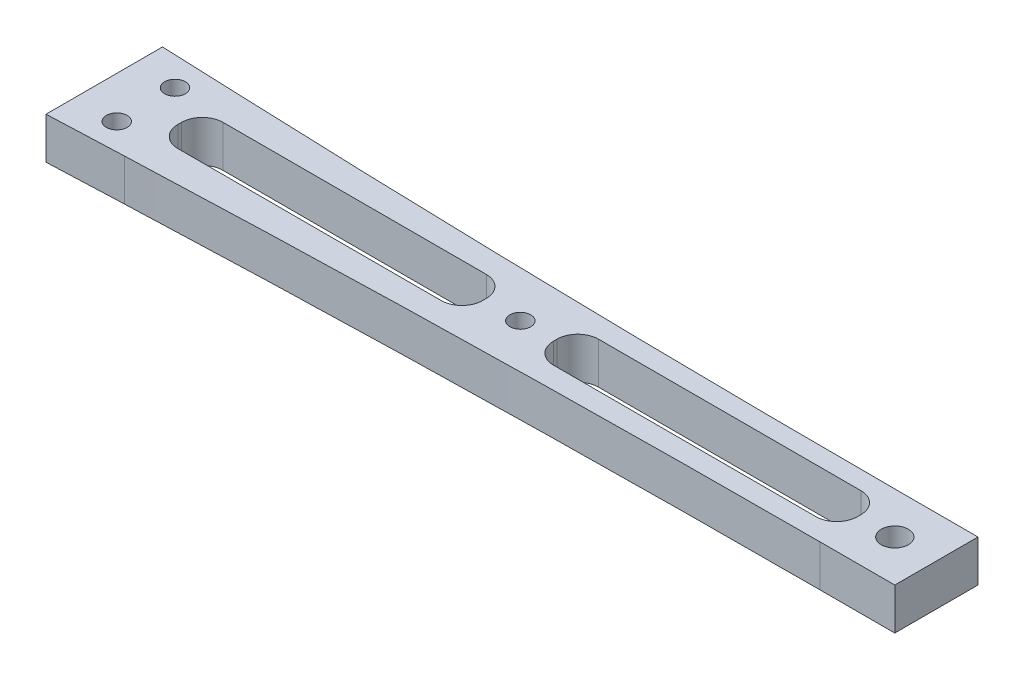
ISO-10303-21;
HEADER;
FILE_DESCRIPTION(('STEP AP214'),'2;1');
FILE_NAME('part.step','',(''),(''),'','','');
FILE_SCHEMA(('AUTOMOTIVE_DESIGN { 1 0 10303 214 1 1 1 1 }'));
ENDSEC;
DATA;
#1=APPLICATION_CONTEXT('core data for automotive mechanical design processes');
#2=APPLICATION_PROTOCOL_DEFINITION('international standard','automotive_design',2000,#1);
#3=PRODUCT_CONTEXT('',#1,'mechanical');
#4=PRODUCT('Part','Part','',(#3));
#5=PRODUCT_RELATED_PRODUCT_CATEGORY('part','',(#4));
#6=PRODUCT_DEFINITION_FORMATION('','',#4);
#7=PRODUCT_DEFINITION_CONTEXT('part definition',#1,'design');
#8=PRODUCT_DEFINITION('design','',#6,#7);
#9=PRODUCT_DEFINITION_SHAPE('','',#8);
#10=(LENGTH_UNIT() NAMED_UNIT(*) SI_UNIT(.MILLI.,.METRE.));
#11=(NAMED_UNIT(*) PLANE_ANGLE_UNIT() SI_UNIT($,.RADIAN.));
#12=(NAMED_UNIT(*) SI_UNIT($,.STERADIAN.) SOLID_ANGLE_UNIT());
#13=UNCERTAINTY_MEASURE_WITH_UNIT(LENGTH_MEASURE(1.E-05),#10,'distance_accuracy_value','');
#14=(GEOMETRIC_REPRESENTATION_CONTEXT(3) GLOBAL_UNCERTAINTY_ASSIGNED_CONTEXT((#13)) GLOBAL_UNIT_ASSIGNED_CONTEXT((#10,
#11,#12)) REPRESENTATION_CONTEXT('',''));
#15=CARTESIAN_POINT('',(0.,0.,0.));
#16=DIRECTION('',(0.,0.,1.));
#17=DIRECTION('',(1.,0.,0.));
#18=AXIS2_PLACEMENT_3D('',#15,#16,#17);
#19=CARTESIAN_POINT('',(113.225148065724,10.,-10.5745762799879));
#20=DIRECTION('',(0.,-1.,0.));
#21=DIRECTION('',(0.,0.,-1.));
#22=AXIS2_PLACEMENT_3D('',#19,#20,#21);
#23=CYLINDRICAL_SURFACE('',#22,5.00000000000001);
#24=CARTESIAN_POINT('',(113.225148065724,0.,-10.5745762799879));
#25=DIRECTION('',(0.,1.,0.));
#26=DIRECTION('',(0.,0.,1.));
#27=AXIS2_PLACEMENT_3D('',#24,#25,#26);
#28=CIRCLE('',#27,5.00000000000001);
#29=CARTESIAN_POINT('',(113.225148065724,0.,-15.5745762799879));
#30=VERTEX_POINT('',#29);
#31=CARTESIAN_POINT('',(108.225148065724,0.,-10.5745762799879));
#32=VERTEX_POINT('',#31);
#33=EDGE_CURVE('E385',#30,#32,#28,.T.);
#34=ORIENTED_EDGE('',*,*,#33,.F.);
#35=DIRECTION('',(0.,-1.,0.));
#36=VECTOR('',#35,1.);
#37=CARTESIAN_POINT('',(113.225148065724,10.,-15.5745762799879));
#38=LINE('',#37,#36);
#39=CARTESIAN_POINT('',(113.225148065724,10.,-15.5745762799879));
#40=VERTEX_POINT('',#39);
#41=EDGE_CURVE('E254',#40,#30,#38,.T.);
#42=ORIENTED_EDGE('',*,*,#41,.F.);
#43=CARTESIAN_POINT('',(113.225148065724,10.,-10.5745762799879));
#44=DIRECTION('',(0.,1.,0.));
#45=DIRECTION('',(0.,0.,1.));
#46=AXIS2_PLACEMENT_3D('',#43,#44,#45);
#47=CIRCLE('',#46,5.00000000000001);
#48=CARTESIAN_POINT('',(108.225148065724,10.,-10.5745762799879));
#49=VERTEX_POINT('',#48);
#50=EDGE_CURVE('E474',#40,#49,#47,.T.);
#51=ORIENTED_EDGE('',*,*,#50,.T.);
#52=DIRECTION('',(0.,-1.,0.));
#53=VECTOR('',#52,1.);
#54=CARTESIAN_POINT('',(108.225148065724,10.,-10.5745762799879));
#55=LINE('',#54,#53);
#56=EDGE_CURVE('E289',#49,#32,#55,.T.);
#57=ORIENTED_EDGE('',*,*,#56,.T.);
#58=EDGE_LOOP('',(#34,#42,#51,#57));
#59=FACE_BOUND('',#58,.T.);
#60=ADVANCED_FACE('F48',(#59),#23,.F.);
#61=CARTESIAN_POINT('',(0.,10.,-15.5745762799879));
#62=DIRECTION('',(0.,0.,-1.));
#63=DIRECTION('',(-1.,0.,0.));
#64=AXIS2_PLACEMENT_3D('',#61,#62,#63);
#65=PLANE('',#64);
#66=DIRECTION('',(1.,0.,0.));
#67=VECTOR('',#66,1.);
#68=CARTESIAN_POINT('',(0.,0.,-15.5745762799879));
#69=LINE('',#68,#67);
#70=CARTESIAN_POINT('',(176.28620966279,0.,-15.5745762799879));
#71=VERTEX_POINT('',#70);
#72=EDGE_CURVE('E389',#30,#71,#69,.T.);
#73=ORIENTED_EDGE('',*,*,#72,.T.);
#74=DIRECTION('',(0.,-1.,0.));
#75=VECTOR('',#74,1.);
#76=CARTESIAN_POINT('',(176.28620966279,10.,-15.5745762799879));
#77=LINE('',#76,#75);
#78=CARTESIAN_POINT('',(176.28620966279,10.,-15.5745762799879));
#79=VERTEX_POINT('',#78);
#80=EDGE_CURVE('E271',#79,#71,#77,.T.);
#81=ORIENTED_EDGE('',*,*,#80,.F.);
#82=DIRECTION('',(1.,0.,0.));
#83=VECTOR('',#82,1.);
#84=CARTESIAN_POINT('',(0.,10.,-15.5745762799879));
#85=LINE('',#84,#83);
#86=EDGE_CURVE('E478',#40,#79,#85,.T.);
#87=ORIENTED_EDGE('',*,*,#86,.F.);
#88=ORIENTED_EDGE('',*,*,#41,.T.);
#89=EDGE_LOOP('',(#73,#81,#87,#88));
#90=FACE_BOUND('',#89,.T.);
#91=ADVANCED_FACE('F530',(#90),#65,.F.);
#92=CARTESIAN_POINT('',(176.28620966279,10.,-10.5745762799879));
#93=DIRECTION('',(0.,-1.,0.));
#94=DIRECTION('',(0.,0.,-1.));
#95=AXIS2_PLACEMENT_3D('',#92,#93,#94);
#96=CYLINDRICAL_SURFACE('',#95,4.99999999999999);
#97=CARTESIAN_POINT('',(176.28620966279,0.,-10.5745762799879));
#98=DIRECTION('',(0.,1.,0.));
#99=DIRECTION('',(0.,0.,1.));
#100=AXIS2_PLACEMENT_3D('',#97,#98,#99);
#101=CIRCLE('',#100,4.99999999999999);
#102=CARTESIAN_POINT('',(181.28620966279,0.,-10.5745762799879));
#103=VERTEX_POINT('',#102);
#104=EDGE_CURVE('E393',#103,#71,#101,.T.);
#105=ORIENTED_EDGE('',*,*,#104,.F.);
#106=DIRECTION('',(0.,-1.,0.));
#107=VECTOR('',#106,1.);
#108=CARTESIAN_POINT('',(181.28620966279,10.,-10.5745762799879));
#109=LINE('',#108,#107);
#110=CARTESIAN_POINT('',(181.28620966279,10.,-10.5745762799879));
#111=VERTEX_POINT('',#110);
#112=EDGE_CURVE('E274',#111,#103,#109,.T.);
#113=ORIENTED_EDGE('',*,*,#112,.F.);
#114=CARTESIAN_POINT('',(176.28620966279,10.,-10.5745762799879));
#115=DIRECTION('',(0.,1.,0.));
#116=DIRECTION('',(0.,0.,1.));
#117=AXIS2_PLACEMENT_3D('',#114,#115,#116);
#118=CIRCLE('',#117,4.99999999999999);
#119=EDGE_CURVE('E481',#111,#79,#118,.T.);
#120=ORIENTED_EDGE('',*,*,#119,.T.);
#121=ORIENTED_EDGE('',*,*,#80,.T.);
#122=EDGE_LOOP('',(#105,#113,#120,#121));
#123=FACE_BOUND('',#122,.T.);
#124=ADVANCED_FACE('F536',(#123),#96,.F.);
#125=CARTESIAN_POINT('',(181.28620966279,10.,0.));
#126=DIRECTION('',(1.,0.,0.));
#127=DIRECTION('',(0.,0.,-1.));
#128=AXIS2_PLACEMENT_3D('',#125,#126,#127);
#129=PLANE('',#128);
#130=DIRECTION('',(0.,0.,1.));
#131=VECTOR('',#130,1.);
#132=CARTESIAN_POINT('',(181.28620966279,0.,0.));
#133=LINE('',#132,#131);
#134=CARTESIAN_POINT('',(181.28620966279,0.,-9.75277634577933));
#135=VERTEX_POINT('',#134);
#136=EDGE_CURVE('E397',#103,#135,#133,.T.);
#137=ORIENTED_EDGE('',*,*,#136,.T.);
#138=DIRECTION('',(0.,-1.,0.));
#139=VECTOR('',#138,1.);
#140=CARTESIAN_POINT('',(181.28620966279,10.,-9.75277634577933));
#141=LINE('',#140,#139);
#142=CARTESIAN_POINT('',(181.28620966279,10.,-9.75277634577933));
#143=VERTEX_POINT('',#142);
#144=EDGE_CURVE('E277',#143,#135,#141,.T.);
#145=ORIENTED_EDGE('',*,*,#144,.F.);
#146=DIRECTION('',(0.,0.,1.));
#147=VECTOR('',#146,1.);
#148=CARTESIAN_POINT('',(181.28620966279,10.,0.));
#149=LINE('',#148,#147);
#150=EDGE_CURVE('E485',#111,#143,#149,.T.);
#151=ORIENTED_EDGE('',*,*,#150,.F.);
#152=ORIENTED_EDGE('',*,*,#112,.T.);
#153=EDGE_LOOP('',(#137,#145,#151,#152));
#154=FACE_BOUND('',#153,.T.);
#155=ADVANCED_FACE('F633',(#154),#129,.F.);
#156=CARTESIAN_POINT('',(176.28620966279,10.,-9.75277634577931));
#157=DIRECTION('',(0.,-1.,0.));
#158=DIRECTION('',(0.,0.,-1.));
#159=AXIS2_PLACEMENT_3D('',#156,#157,#158);
#160=CYLINDRICAL_SURFACE('',#159,4.99999999999999);
#161=CARTESIAN_POINT('',(176.28620966279,0.,-9.75277634577931));
#162=DIRECTION('',(0.,1.,0.));
#163=DIRECTION('',(0.,0.,1.));
#164=AXIS2_PLACEMENT_3D('',#161,#162,#163);
#165=CIRCLE('',#164,4.99999999999999);
#166=CARTESIAN_POINT('',(176.28620966279,0.,-4.75277634577932));
#167=VERTEX_POINT('',#166);
#168=EDGE_CURVE('E401',#167,#135,#165,.T.);
#169=ORIENTED_EDGE('',*,*,#168,.F.);
#170=DIRECTION('',(0.,-1.,0.));
#171=VECTOR('',#170,1.);
#172=CARTESIAN_POINT('',(176.28620966279,10.,-4.75277634577932));
#173=LINE('',#172,#171);
#174=CARTESIAN_POINT('',(176.28620966279,10.,-4.75277634577932));
#175=VERTEX_POINT('',#174);
#176=EDGE_CURVE('E280',#175,#167,#173,.T.);
#177=ORIENTED_EDGE('',*,*,#176,.F.);
#178=CARTESIAN_POINT('',(176.28620966279,10.,-9.75277634577931));
#179=DIRECTION('',(0.,1.,0.));
#180=DIRECTION('',(0.,0.,1.));
#181=AXIS2_PLACEMENT_3D('',#178,#179,#180);
#182=CIRCLE('',#181,4.99999999999999);
#183=EDGE_CURVE('E488',#175,#143,#182,.T.);
#184=ORIENTED_EDGE('',*,*,#183,.T.);
#185=ORIENTED_EDGE('',*,*,#144,.T.);
#186=EDGE_LOOP('',(#169,#177,#184,#185));
#187=FACE_BOUND('',#186,.T.);
#188=ADVANCED_FACE('F629',(#187),#160,.F.);
#189=CARTESIAN_POINT('',(0.,10.,-4.75277634577934));
#190=DIRECTION('',(0.,0.,-1.));
#191=DIRECTION('',(-1.,0.,0.));
#192=AXIS2_PLACEMENT_3D('',#189,#190,#191);
#193=PLANE('',#192);
#194=DIRECTION('',(1.,0.,0.));
#195=VECTOR('',#194,1.);
#196=CARTESIAN_POINT('',(0.,0.,-4.75277634577934));
#197=LINE('',#196,#195);
#198=CARTESIAN_POINT('',(113.225148065724,0.,-4.75277634577933));
#199=VERTEX_POINT('',#198);
#200=EDGE_CURVE('E405',#199,#167,#197,.T.);
#201=ORIENTED_EDGE('',*,*,#200,.F.);
#202=DIRECTION('',(0.,-1.,0.));
#203=VECTOR('',#202,1.);
#204=CARTESIAN_POINT('',(113.225148065724,10.,-4.75277634577933));
#205=LINE('',#204,#203);
#206=CARTESIAN_POINT('',(113.225148065724,10.,-4.75277634577933));
#207=VERTEX_POINT('',#206);
#208=EDGE_CURVE('E283',#207,#199,#205,.T.);
#209=ORIENTED_EDGE('',*,*,#208,.F.);
#210=DIRECTION('',(1.,0.,0.));
#211=VECTOR('',#210,1.);
#212=CARTESIAN_POINT('',(0.,10.,-4.75277634577934));
#213=LINE('',#212,#211);
#214=EDGE_CURVE('E492',#207,#175,#213,.T.);
#215=ORIENTED_EDGE('',*,*,#214,.T.);
#216=ORIENTED_EDGE('',*,*,#176,.T.);
#217=EDGE_LOOP('',(#201,#209,#215,#216));
#218=FACE_BOUND('',#217,.T.);
#219=ADVANCED_FACE('F625',(#218),#193,.T.);
#220=CARTESIAN_POINT('',(113.225148065724,10.,-9.75277634577931));
#221=DIRECTION('',(0.,-1.,0.));
#222=DIRECTION('',(0.,0.,-1.));
#223=AXIS2_PLACEMENT_3D('',#220,#221,#222);
#224=CYLINDRICAL_SURFACE('',#223,5.);
#225=CARTESIAN_POINT('',(113.225148065724,0.,-9.75277634577931));
#226=DIRECTION('',(0.,1.,0.));
#227=DIRECTION('',(0.,0.,1.));
#228=AXIS2_PLACEMENT_3D('',#225,#226,#227);
#229=CIRCLE('',#228,5.);
#230=CARTESIAN_POINT('',(108.225148065724,0.,-9.75277634577933));
#231=VERTEX_POINT('',#230);
#232=EDGE_CURVE('E409',#199,#231,#229,.F.);
#233=ORIENTED_EDGE('',*,*,#232,.T.);
#234=DIRECTION('',(0.,-1.,0.));
#235=VECTOR('',#234,1.);
#236=CARTESIAN_POINT('',(108.225148065724,10.,-9.75277634577933));
#237=LINE('',#236,#235);
#238=CARTESIAN_POINT('',(108.225148065724,10.,-9.75277634577933));
#239=VERTEX_POINT('',#238);
#240=EDGE_CURVE('E286',#239,#231,#237,.T.);
#241=ORIENTED_EDGE('',*,*,#240,.F.);
#242=CARTESIAN_POINT('',(113.225148065724,10.,-9.75277634577931));
#243=DIRECTION('',(0.,1.,0.));
#244=DIRECTION('',(0.,0.,1.));
#245=AXIS2_PLACEMENT_3D('',#242,#243,#244);
#246=CIRCLE('',#245,5.);
#247=EDGE_CURVE('E496',#207,#239,#246,.F.);
#248=ORIENTED_EDGE('',*,*,#247,.F.);
#249=ORIENTED_EDGE('',*,*,#208,.T.);
#250=EDGE_LOOP('',(#233,#241,#248,#249));
#251=FACE_BOUND('',#250,.T.);
#252=ADVANCED_FACE('F573',(#251),#224,.F.);
#253=CARTESIAN_POINT('',(22.9848223233018,10.,-10.5745762799879));
#254=DIRECTION('',(0.,-1.,0.));
#255=DIRECTION('',(0.,0.,-1.));
#256=AXIS2_PLACEMENT_3D('',#253,#254,#255);
#257=CYLINDRICAL_SURFACE('',#256,5.00000000000001);
#258=CARTESIAN_POINT('',(22.9848223233018,0.,-10.5745762799879));
#259=DIRECTION('',(0.,1.,0.));
#260=DIRECTION('',(0.,0.,1.));
#261=AXIS2_PLACEMENT_3D('',#258,#259,#260);
#262=CIRCLE('',#261,5.00000000000001);
#263=CARTESIAN_POINT('',(22.9848223233018,0.,-15.5745762799879));
#264=VERTEX_POINT('',#263);
#265=CARTESIAN_POINT('',(17.9848223233018,0.,-10.5745762799879));
#266=VERTEX_POINT('',#265);
#267=EDGE_CURVE('E353',#264,#266,#262,.T.);
#268=ORIENTED_EDGE('',*,*,#267,.F.);
#269=DIRECTION('',(0.,-1.,0.));
#270=VECTOR('',#269,1.);
#271=CARTESIAN_POINT('',(22.9848223233018,10.,-15.5745762799879));
#272=LINE('',#271,#270);
#273=CARTESIAN_POINT('',(22.9848223233018,10.,-15.5745762799879));
#274=VERTEX_POINT('',#273);
#275=EDGE_CURVE('E292',#274,#264,#272,.T.);
#276=ORIENTED_EDGE('',*,*,#275,.F.);
#277=CARTESIAN_POINT('',(22.9848223233018,10.,-10.5745762799879));
#278=DIRECTION('',(0.,1.,0.));
#279=DIRECTION('',(0.,0.,1.));
#280=AXIS2_PLACEMENT_3D('',#277,#278,#279);
#281=CIRCLE('',#280,5.00000000000001);
#282=CARTESIAN_POINT('',(17.9848223233018,10.,-10.5745762799879));
#283=VERTEX_POINT('',#282);
#284=EDGE_CURVE('E445',#274,#283,#281,.T.);
#285=ORIENTED_EDGE('',*,*,#284,.T.);
#286=DIRECTION('',(0.,-1.,0.));
#287=VECTOR('',#286,1.);
#288=CARTESIAN_POINT('',(17.9848223233018,10.,-10.5745762799879));
#289=LINE('',#288,#287);
#290=EDGE_CURVE('E240',#283,#266,#289,.T.);
#291=ORIENTED_EDGE('',*,*,#290,.T.);
#292=EDGE_LOOP('',(#268,#276,#285,#291));
#293=FACE_BOUND('',#292,.T.);
#294=ADVANCED_FACE('F569',(#293),#257,.F.);
#295=CARTESIAN_POINT('',(0.,10.,-15.5745762799879));
#296=DIRECTION('',(0.,0.,-1.));
#297=DIRECTION('',(-1.,0.,0.));
#298=AXIS2_PLACEMENT_3D('',#295,#296,#297);
#299=PLANE('',#298);
#300=DIRECTION('',(1.,0.,0.));
#301=VECTOR('',#300,1.);
#302=CARTESIAN_POINT('',(0.,0.,-15.5745762799879));
#303=LINE('',#302,#301);
#304=CARTESIAN_POINT('',(86.2593923796302,0.,-15.5745762799879));
#305=VERTEX_POINT('',#304);
#306=EDGE_CURVE('E357',#264,#305,#303,.T.);
#307=ORIENTED_EDGE('',*,*,#306,.T.);
#308=DIRECTION('',(0.,-1.,0.));
#309=VECTOR('',#308,1.);
#310=CARTESIAN_POINT('',(86.2593923796302,10.,-15.5745762799879));
#311=LINE('',#310,#309);
#312=CARTESIAN_POINT('',(86.2593923796302,10.,-15.5745762799879));
#313=VERTEX_POINT('',#312);
#314=EDGE_CURVE('E295',#313,#305,#311,.T.);
#315=ORIENTED_EDGE('',*,*,#314,.F.);
#316=DIRECTION('',(1.,0.,0.));
#317=VECTOR('',#316,1.);
#318=CARTESIAN_POINT('',(0.,10.,-15.5745762799879));
#319=LINE('',#318,#317);
#320=EDGE_CURVE('E449',#274,#313,#319,.T.);
#321=ORIENTED_EDGE('',*,*,#320,.F.);
#322=ORIENTED_EDGE('',*,*,#275,.T.);
#323=EDGE_LOOP('',(#307,#315,#321,#322));
#324=FACE_BOUND('',#323,.T.);
#325=ADVANCED_FACE('F565',(#324),#299,.F.);
#326=CARTESIAN_POINT('',(86.2593923796302,10.,-10.5745762799879));
#327=DIRECTION('',(0.,-1.,0.));
#328=DIRECTION('',(0.,0.,-1.));
#329=AXIS2_PLACEMENT_3D('',#326,#327,#328);
#330=CYLINDRICAL_SURFACE('',#329,4.99999999999999);
#331=CARTESIAN_POINT('',(86.2593923796302,0.,-10.5745762799879));
#332=DIRECTION('',(0.,1.,0.));
#333=DIRECTION('',(0.,0.,1.));
#334=AXIS2_PLACEMENT_3D('',#331,#332,#333);
#335=CIRCLE('',#334,4.99999999999999);
#336=CARTESIAN_POINT('',(91.2593923796302,0.,-10.5745762799879));
#337=VERTEX_POINT('',#336);
#338=EDGE_CURVE('E361',#337,#305,#335,.T.);
#339=ORIENTED_EDGE('',*,*,#338,.F.);
#340=DIRECTION('',(0.,-1.,0.));
#341=VECTOR('',#340,1.);
#342=CARTESIAN_POINT('',(91.2593923796302,10.,-10.5745762799879));
#343=LINE('',#342,#341);
#344=CARTESIAN_POINT('',(91.2593923796302,10.,-10.5745762799879));
#345=VERTEX_POINT('',#344);
#346=EDGE_CURVE('E298',#345,#337,#343,.T.);
#347=ORIENTED_EDGE('',*,*,#346,.F.);
#348=CARTESIAN_POINT('',(86.2593923796302,10.,-10.5745762799879));
#349=DIRECTION('',(0.,1.,0.));
#350=DIRECTION('',(0.,0.,1.));
#351=AXIS2_PLACEMENT_3D('',#348,#349,#350);
#352=CIRCLE('',#351,4.99999999999999);
#353=EDGE_CURVE('E452',#345,#313,#352,.T.);
#354=ORIENTED_EDGE('',*,*,#353,.T.);
#355=ORIENTED_EDGE('',*,*,#314,.T.);
#356=EDGE_LOOP('',(#339,#347,#354,#355));
#357=FACE_BOUND('',#356,.T.);
#358=ADVANCED_FACE('F561',(#357),#330,.F.);
#359=CARTESIAN_POINT('',(91.2593923796302,10.,0.));
#360=DIRECTION('',(1.,0.,0.));
#361=DIRECTION('',(0.,0.,-1.));
#362=AXIS2_PLACEMENT_3D('',#359,#360,#361);
#363=PLANE('',#362);
#364=DIRECTION('',(0.,0.,1.));
#365=VECTOR('',#364,1.);
#366=CARTESIAN_POINT('',(91.2593923796302,0.,0.));
#367=LINE('',#366,#365);
#368=CARTESIAN_POINT('',(91.2593923796302,0.,-9.69671937911455));
#369=VERTEX_POINT('',#368);
#370=EDGE_CURVE('E365',#337,#369,#367,.T.);
#371=ORIENTED_EDGE('',*,*,#370,.T.);
#372=DIRECTION('',(0.,-1.,0.));
#373=VECTOR('',#372,1.);
#374=CARTESIAN_POINT('',(91.2593923796302,10.,-9.69671937911455));
#375=LINE('',#374,#373);
#376=CARTESIAN_POINT('',(91.2593923796302,10.,-9.69671937911455));
#377=VERTEX_POINT('',#376);
#378=EDGE_CURVE('E301',#377,#369,#375,.T.);
#379=ORIENTED_EDGE('',*,*,#378,.F.);
#380=DIRECTION('',(0.,0.,1.));
#381=VECTOR('',#380,1.);
#382=CARTESIAN_POINT('',(91.2593923796302,10.,0.));
#383=LINE('',#382,#381);
#384=EDGE_CURVE('E456',#345,#377,#383,.T.);
#385=ORIENTED_EDGE('',*,*,#384,.F.);
#386=ORIENTED_EDGE('',*,*,#346,.T.);
#387=EDGE_LOOP('',(#371,#379,#385,#386));
#388=FACE_BOUND('',#387,.T.);
#389=ADVANCED_FACE('F557',(#388),#363,.F.);
#390=CARTESIAN_POINT('',(86.2593923796302,10.,-9.69671937911454));
#391=DIRECTION('',(0.,-1.,0.));
#392=DIRECTION('',(0.,0.,-1.));
#393=AXIS2_PLACEMENT_3D('',#390,#391,#392);
#394=CYLINDRICAL_SURFACE('',#393,4.99999999999999);
#395=CARTESIAN_POINT('',(86.2593923796302,0.,-9.69671937911454));
#396=DIRECTION('',(0.,1.,0.));
#397=DIRECTION('',(0.,0.,1.));
#398=AXIS2_PLACEMENT_3D('',#395,#396,#397);
#399=CIRCLE('',#398,4.99999999999999);
#400=CARTESIAN_POINT('',(86.2593923796302,0.,-4.69671937911453));
#401=VERTEX_POINT('',#400);
#402=EDGE_CURVE('E369',#401,#369,#399,.T.);
#403=ORIENTED_EDGE('',*,*,#402,.F.);
#404=DIRECTION('',(0.,-1.,0.));
#405=VECTOR('',#404,1.);
#406=CARTESIAN_POINT('',(86.2593923796302,10.,-4.69671937911453));
#407=LINE('',#406,#405);
#408=CARTESIAN_POINT('',(86.2593923796302,10.,-4.69671937911453));
#409=VERTEX_POINT('',#408);
#410=EDGE_CURVE('E304',#409,#401,#407,.T.);
#411=ORIENTED_EDGE('',*,*,#410,.F.);
#412=CARTESIAN_POINT('',(86.2593923796302,10.,-9.69671937911454));
#413=DIRECTION('',(0.,1.,0.));
#414=DIRECTION('',(0.,0.,1.));
#415=AXIS2_PLACEMENT_3D('',#412,#413,#414);
#416=CIRCLE('',#415,4.99999999999999);
#417=EDGE_CURVE('E459',#409,#377,#416,.T.);
#418=ORIENTED_EDGE('',*,*,#417,.T.);
#419=ORIENTED_EDGE('',*,*,#378,.T.);
#420=EDGE_LOOP('',(#403,#411,#418,#419));
#421=FACE_BOUND('',#420,.T.);
#422=ADVANCED_FACE('F553',(#421),#394,.F.);
#423=CARTESIAN_POINT('',(0.,10.,-4.69671937911455));
#424=DIRECTION('',(0.,0.,-1.));
#425=DIRECTION('',(-1.,0.,0.));
#426=AXIS2_PLACEMENT_3D('',#423,#424,#425);
#427=PLANE('',#426);
#428=DIRECTION('',(1.,0.,0.));
#429=VECTOR('',#428,1.);
#430=CARTESIAN_POINT('',(0.,0.,-4.69671937911455));
#431=LINE('',#430,#429);
#432=CARTESIAN_POINT('',(22.9848223233018,0.,-4.69671937911455));
#433=VERTEX_POINT('',#432);
#434=EDGE_CURVE('E373',#433,#401,#431,.T.);
#435=ORIENTED_EDGE('',*,*,#434,.F.);
#436=DIRECTION('',(0.,-1.,0.));
#437=VECTOR('',#436,1.);
#438=CARTESIAN_POINT('',(22.9848223233018,10.,-4.69671937911455));
#439=LINE('',#438,#437);
#440=CARTESIAN_POINT('',(22.9848223233018,10.,-4.69671937911455));
#441=VERTEX_POINT('',#440);
#442=EDGE_CURVE('E307',#441,#433,#439,.T.);
#443=ORIENTED_EDGE('',*,*,#442,.F.);
#444=DIRECTION('',(1.,0.,0.));
#445=VECTOR('',#444,1.);
#446=CARTESIAN_POINT('',(0.,10.,-4.69671937911455));
#447=LINE('',#446,#445);
#448=EDGE_CURVE('E463',#441,#409,#447,.T.);
#449=ORIENTED_EDGE('',*,*,#448,.T.);
#450=ORIENTED_EDGE('',*,*,#410,.T.);
#451=EDGE_LOOP('',(#435,#443,#449,#450));
#452=FACE_BOUND('',#451,.T.);
#453=ADVANCED_FACE('F549',(#452),#427,.T.);
#454=CARTESIAN_POINT('',(22.9848223233018,10.,-9.69671937911454));
#455=DIRECTION('',(0.,-1.,0.));
#456=DIRECTION('',(0.,0.,-1.));
#457=AXIS2_PLACEMENT_3D('',#454,#455,#456);
#458=CYLINDRICAL_SURFACE('',#457,5.);
#459=CARTESIAN_POINT('',(22.9848223233018,0.,-9.69671937911454));
#460=DIRECTION('',(0.,1.,0.));
#461=DIRECTION('',(0.,0.,1.));
#462=AXIS2_PLACEMENT_3D('',#459,#460,#461);
#463=CIRCLE('',#462,5.);
#464=CARTESIAN_POINT('',(17.9848223233018,0.,-9.69671937911455));
#465=VERTEX_POINT('',#464);
#466=EDGE_CURVE('E377',#465,#433,#463,.T.);
#467=ORIENTED_EDGE('',*,*,#466,.F.);
#468=DIRECTION('',(0.,-1.,0.));
#469=VECTOR('',#468,1.);
#470=CARTESIAN_POINT('',(17.9848223233018,10.,-9.69671937911455));
#471=LINE('',#470,#469);
#472=CARTESIAN_POINT('',(17.9848223233018,10.,-9.69671937911455));
#473=VERTEX_POINT('',#472);
#474=EDGE_CURVE('E244',#473,#465,#471,.T.);
#475=ORIENTED_EDGE('',*,*,#474,.F.);
#476=CARTESIAN_POINT('',(22.9848223233018,10.,-9.69671937911454));
#477=DIRECTION('',(0.,1.,0.));
#478=DIRECTION('',(0.,0.,1.));
#479=AXIS2_PLACEMENT_3D('',#476,#477,#478);
#480=CIRCLE('',#479,5.);
#481=EDGE_CURVE('E467',#473,#441,#480,.T.);
#482=ORIENTED_EDGE('',*,*,#481,.T.);
#483=ORIENTED_EDGE('',*,*,#442,.T.);
#484=EDGE_LOOP('',(#467,#475,#482,#483));
#485=FACE_BOUND('',#484,.T.);
#486=ADVANCED_FACE('F546',(#485),#458,.F.);
#487=CARTESIAN_POINT('',(0.958466453674131,10.,-23.961661341853));
#488=DIRECTION('',(-0.039968038348872,0.,0.999200958721789));
#489=DIRECTION('',(0.999200958721789,0.,0.039968038348872));
#490=AXIS2_PLACEMENT_3D('',#487,#488,#489);
#491=PLANE('',#490);
#492=DIRECTION('',(-0.999200958721789,0.,-0.039968038348872));
#493=VECTOR('',#492,1.);
#494=CARTESIAN_POINT('',(0.958466453674131,10.,-23.961661341853));
#495=LINE('',#494,#493);
#496=CARTESIAN_POINT('',(18.0982689834271,10.,-23.2760692406629));
#497=VERTEX_POINT('',#496);
#498=CARTESIAN_POINT('',(0.,10.,-24.));
#499=VERTEX_POINT('',#498);
#500=EDGE_CURVE('E210',#497,#499,#495,.T.);
#501=ORIENTED_EDGE('',*,*,#500,.F.);
#502=DIRECTION('',(0.,-1.,0.));
#503=VECTOR('',#502,1.);
#504=CARTESIAN_POINT('',(18.0982689834271,0.,-23.2760692406629));
#505=LINE('',#504,#503);
#506=CARTESIAN_POINT('',(18.0982689834271,0.,-23.2760692406629));
#507=VERTEX_POINT('',#506);
#508=EDGE_CURVE('E250',#497,#507,#505,.T.);
#509=ORIENTED_EDGE('',*,*,#508,.T.);
#510=DIRECTION('',(-0.999200958721789,0.,-0.039968038348872));
#511=VECTOR('',#510,1.);
#512=CARTESIAN_POINT('',(0.958466453674131,0.,-23.961661341853));
#513=LINE('',#512,#511);
#514=CARTESIAN_POINT('',(0.,0.,-24.));
#515=VERTEX_POINT('',#514);
#516=EDGE_CURVE('E237',#507,#515,#513,.T.);
#517=ORIENTED_EDGE('',*,*,#516,.T.);
#518=DIRECTION('',(0.,-1.,0.));
#519=VECTOR('',#518,1.);
#520=CARTESIAN_POINT('',(0.,10.,-24.));
#521=LINE('',#520,#519);
#522=EDGE_CURVE('E229',#499,#515,#521,.T.);
#523=ORIENTED_EDGE('',*,*,#522,.F.);
#524=EDGE_LOOP('',(#501,#509,#517,#523));
#525=FACE_BOUND('',#524,.T.);
#526=ADVANCED_FACE('F235',(#525),#491,.F.);
#527=CARTESIAN_POINT('',(0.,10.,0.));
#528=DIRECTION('',(1.,0.,0.));
#529=DIRECTION('',(0.,0.,-1.));
#530=AXIS2_PLACEMENT_3D('',#527,#528,#529);
#531=PLANE('',#530);
#532=DIRECTION('',(0.,0.,1.));
#533=VECTOR('',#532,1.);
#534=CARTESIAN_POINT('',(0.,0.,0.));
#535=LINE('',#534,#533);
#536=CARTESIAN_POINT('',(0.,0.,4.));
#537=VERTEX_POINT('',#536);
#538=EDGE_CURVE('E347',#515,#537,#535,.T.);
#539=ORIENTED_EDGE('',*,*,#538,.T.);
#540=DIRECTION('',(0.,-1.,0.));
#541=VECTOR('',#540,1.);
#542=CARTESIAN_POINT('',(0.,10.,4.));
#543=LINE('',#542,#541);
#544=CARTESIAN_POINT('',(0.,10.,4.));
#545=VERTEX_POINT('',#544);
#546=EDGE_CURVE('E231',#545,#537,#543,.T.);
#547=ORIENTED_EDGE('',*,*,#546,.F.);
#548=DIRECTION('',(0.,0.,1.));
#549=VECTOR('',#548,1.);
#550=CARTESIAN_POINT('',(0.,10.,0.));
#551=LINE('',#550,#549);
#552=EDGE_CURVE('E215',#499,#545,#551,.T.);
#553=ORIENTED_EDGE('',*,*,#552,.F.);
#554=ORIENTED_EDGE('',*,*,#522,.T.);
#555=EDGE_LOOP('',(#539,#547,#553,#554));
#556=FACE_BOUND('',#555,.T.);
#557=ADVANCED_FACE('F228',(#556),#531,.F.);
#558=CARTESIAN_POINT('',(0.159744408945687,10.,3.99361022364217));
#559=DIRECTION('',(-0.0399680383488716,0.,-0.99920095872179));
#560=DIRECTION('',(-0.999200958721789,0.,0.0399680383488716));
#561=AXIS2_PLACEMENT_3D('',#558,#559,#560);
#562=PLANE('',#561);
#563=DIRECTION('',(0.99920095872179,0.,-0.0399680383488716));
#564=VECTOR('',#563,1.);
#565=CARTESIAN_POINT('',(0.159744408945687,0.,3.99361022364217));
#566=LINE('',#565,#564);
#567=CARTESIAN_POINT('',(18.0982689834269,0.,3.27606924066292));
#568=VERTEX_POINT('',#567);
#569=EDGE_CURVE('E344',#537,#568,#566,.T.);
#570=ORIENTED_EDGE('',*,*,#569,.T.);
#571=DIRECTION('',(0.,-1.,0.));
#572=VECTOR('',#571,1.);
#573=CARTESIAN_POINT('',(18.0982689834269,10.,3.27606924066292));
#574=LINE('',#573,#572);
#575=CARTESIAN_POINT('',(18.0982689834269,10.,3.27606924066292));
#576=VERTEX_POINT('',#575);
#577=EDGE_CURVE('E65',#568,#576,#574,.F.);
#578=ORIENTED_EDGE('',*,*,#577,.T.);
#579=DIRECTION('',(0.99920095872179,0.,-0.0399680383488716));
#580=VECTOR('',#579,1.);
#581=CARTESIAN_POINT('',(0.159744408945687,10.,3.99361022364217));
#582=LINE('',#581,#580);
#583=EDGE_CURVE('E233',#545,#576,#582,.T.);
#584=ORIENTED_EDGE('',*,*,#583,.F.);
#585=ORIENTED_EDGE('',*,*,#546,.T.);
#586=EDGE_LOOP('',(#570,#578,#584,#585));
#587=FACE_BOUND('',#586,.T.);
#588=ADVANCED_FACE('F516',(#587),#562,.F.);
#589=CARTESIAN_POINT('',(0.,10.,0.));
#590=DIRECTION('',(0.,0.,1.));
#591=DIRECTION('',(1.,0.,0.));
#592=AXIS2_PLACEMENT_3D('',#589,#590,#591);
#593=PLANE('',#592);
#594=DIRECTION('',(-1.,0.,0.));
#595=VECTOR('',#594,1.);
#596=CARTESIAN_POINT('',(0.,10.,0.));
#597=LINE('',#596,#595);
#598=CARTESIAN_POINT('',(200.,10.,0.));
#599=VERTEX_POINT('',#598);
#600=CARTESIAN_POINT('',(181.967226213798,10.,0.));
#601=VERTEX_POINT('',#600);
#602=EDGE_CURVE('E437',#599,#601,#597,.T.);
#603=ORIENTED_EDGE('',*,*,#602,.T.);
#604=DIRECTION('',(0.,-1.,0.));
#605=VECTOR('',#604,1.);
#606=CARTESIAN_POINT('',(181.967226213798,10.,0.));
#607=LINE('',#606,#605);
#608=CARTESIAN_POINT('',(181.967226213798,0.,0.));
#609=VERTEX_POINT('',#608);
#610=EDGE_CURVE('E257',#601,#609,#607,.T.);
#611=ORIENTED_EDGE('',*,*,#610,.T.);
#612=DIRECTION('',(-1.,0.,0.));
#613=VECTOR('',#612,1.);
#614=CARTESIAN_POINT('',(0.,0.,0.));
#615=LINE('',#614,#613);
#616=CARTESIAN_POINT('',(200.,0.,0.));
#617=VERTEX_POINT('',#616);
#618=EDGE_CURVE('E336',#617,#609,#615,.T.);
#619=ORIENTED_EDGE('',*,*,#618,.F.);
#620=DIRECTION('',(0.,-1.,0.));
#621=VECTOR('',#620,1.);
#622=CARTESIAN_POINT('',(200.,10.,0.));
#623=LINE('',#622,#621);
#624=EDGE_CURVE('E246',#599,#617,#623,.T.);
#625=ORIENTED_EDGE('',*,*,#624,.F.);
#626=EDGE_LOOP('',(#603,#611,#619,#625));
#627=FACE_BOUND('',#626,.T.);
#628=ADVANCED_FACE('F341',(#627),#593,.T.);
#629=CARTESIAN_POINT('',(200.,10.,0.));
#630=DIRECTION('',(-1.,0.,0.));
#631=DIRECTION('',(0.,0.,1.));
#632=AXIS2_PLACEMENT_3D('',#629,#630,#631);
#633=PLANE('',#632);
#634=DIRECTION('',(0.,0.,-1.));
#635=VECTOR('',#634,1.);
#636=CARTESIAN_POINT('',(200.,0.,0.));
#637=LINE('',#636,#635);
#638=CARTESIAN_POINT('',(200.,0.,-20.));
#639=VERTEX_POINT('',#638);
#640=EDGE_CURVE('E327',#617,#639,#637,.T.);
#641=ORIENTED_EDGE('',*,*,#640,.T.);
#642=DIRECTION('',(0.,-1.,0.));
#643=VECTOR('',#642,1.);
#644=CARTESIAN_POINT('',(200.,10.,-20.));
#645=LINE('',#644,#643);
#646=CARTESIAN_POINT('',(200.,10.,-20.));
#647=VERTEX_POINT('',#646);
#648=EDGE_CURVE('E317',#647,#639,#645,.T.);
#649=ORIENTED_EDGE('',*,*,#648,.F.);
#650=DIRECTION('',(0.,0.,-1.));
#651=VECTOR('',#650,1.);
#652=CARTESIAN_POINT('',(200.,10.,0.));
#653=LINE('',#652,#651);
#654=EDGE_CURVE('E328',#599,#647,#653,.T.);
#655=ORIENTED_EDGE('',*,*,#654,.F.);
#656=ORIENTED_EDGE('',*,*,#624,.T.);
#657=EDGE_LOOP('',(#641,#649,#655,#656));
#658=FACE_BOUND('',#657,.T.);
#659=ADVANCED_FACE('F325',(#658),#633,.F.);
#660=CARTESIAN_POINT('',(17.9848223233018,10.,0.));
#661=DIRECTION('',(1.,0.,0.));
#662=DIRECTION('',(0.,0.,-1.));
#663=AXIS2_PLACEMENT_3D('',#660,#661,#662);
#664=PLANE('',#663);
#665=DIRECTION('',(0.,0.,1.));
#666=VECTOR('',#665,1.);
#667=CARTESIAN_POINT('',(17.9848223233018,0.,0.));
#668=LINE('',#667,#666);
#669=EDGE_CURVE('E381',#266,#465,#668,.T.);
#670=ORIENTED_EDGE('',*,*,#669,.F.);
#671=ORIENTED_EDGE('',*,*,#290,.F.);
#672=DIRECTION('',(0.,0.,1.));
#673=VECTOR('',#672,1.);
#674=CARTESIAN_POINT('',(17.9848223233018,10.,0.));
#675=LINE('',#674,#673);
#676=EDGE_CURVE('E471',#283,#473,#675,.T.);
#677=ORIENTED_EDGE('',*,*,#676,.T.);
#678=ORIENTED_EDGE('',*,*,#474,.T.);
#679=EDGE_LOOP('',(#670,#671,#677,#678));
#680=FACE_BOUND('',#679,.T.);
#681=ADVANCED_FACE('F542',(#680),#664,.T.);
#682=CARTESIAN_POINT('',(0.,10.,-20.));
#683=DIRECTION('',(0.,0.,1.));
#684=DIRECTION('',(1.,0.,0.));
#685=AXIS2_PLACEMENT_3D('',#682,#683,#684);
#686=PLANE('',#685);
#687=DIRECTION('',(-1.,0.,0.));
#688=VECTOR('',#687,1.);
#689=CARTESIAN_POINT('',(0.,0.,-20.));
#690=LINE('',#689,#688);
#691=CARTESIAN_POINT('',(181.967226213802,0.,-20.));
#692=VERTEX_POINT('',#691);
#693=EDGE_CURVE('E338',#639,#692,#690,.T.);
#694=ORIENTED_EDGE('',*,*,#693,.T.);
#695=DIRECTION('',(0.,-1.,0.));
#696=VECTOR('',#695,1.);
#697=CARTESIAN_POINT('',(181.967226213802,10.,-20.));
#698=LINE('',#697,#696);
#699=CARTESIAN_POINT('',(181.967226213802,10.,-20.));
#700=VERTEX_POINT('',#699);
#701=EDGE_CURVE('E253',#692,#700,#698,.F.);
#702=ORIENTED_EDGE('',*,*,#701,.T.);
#703=DIRECTION('',(-1.,0.,0.));
#704=VECTOR('',#703,1.);
#705=CARTESIAN_POINT('',(0.,10.,-20.));
#706=LINE('',#705,#704);
#707=EDGE_CURVE('E442',#647,#700,#706,.T.);
#708=ORIENTED_EDGE('',*,*,#707,.F.);
#709=ORIENTED_EDGE('',*,*,#648,.T.);
#710=EDGE_LOOP('',(#694,#702,#708,#709));
#711=FACE_BOUND('',#710,.T.);
#712=ADVANCED_FACE('F545',(#711),#686,.F.);
#713=CARTESIAN_POINT('',(10.,10.,-17.));
#714=DIRECTION('',(0.,-1.,0.));
#715=DIRECTION('',(0.,0.,-1.));
#716=AXIS2_PLACEMENT_3D('',#713,#714,#715);
#717=CYLINDRICAL_SURFACE('',#716,2.5);
#718=CARTESIAN_POINT('',(10.,10.,-17.));
#719=DIRECTION('',(0.,1.,0.));
#720=DIRECTION('',(0.,0.,1.));
#721=AXIS2_PLACEMENT_3D('',#718,#719,#720);
#722=CIRCLE('',#721,2.5);
#723=CARTESIAN_POINT('',(10.,10.,-14.5));
#724=VERTEX_POINT('',#723);
#725=EDGE_CURVE('E224',#724,#724,#722,.T.);
#726=ORIENTED_EDGE('',*,*,#725,.T.);
#727=EDGE_LOOP('',(#726));
#728=FACE_BOUND('',#727,.T.);
#729=CARTESIAN_POINT('',(10.,0.,-17.));
#730=DIRECTION('',(0.,1.,0.));
#731=DIRECTION('',(0.,0.,1.));
#732=AXIS2_PLACEMENT_3D('',#729,#730,#731);
#733=CIRCLE('',#732,2.5);
#734=CARTESIAN_POINT('',(10.,0.,-14.5));
#735=VERTEX_POINT('',#734);
#736=EDGE_CURVE('E510',#735,#735,#733,.T.);
#737=ORIENTED_EDGE('',*,*,#736,.F.);
#738=EDGE_LOOP('',(#737));
#739=FACE_BOUND('',#738,.T.);
#740=ADVANCED_FACE('F577',(#728,#739),#717,.F.);
#741=CARTESIAN_POINT('',(190.,10.,-10.));
#742=DIRECTION('',(0.,-1.,0.));
#743=DIRECTION('',(0.,0.,-1.));
#744=AXIS2_PLACEMENT_3D('',#741,#742,#743);
#745=CYLINDRICAL_SURFACE('',#744,3.25000000000001);
#746=CARTESIAN_POINT('',(190.,10.,-10.));
#747=DIRECTION('',(0.,1.,0.));
#748=DIRECTION('',(0.,0.,1.));
#749=AXIS2_PLACEMENT_3D('',#746,#747,#748);
#750=CIRCLE('',#749,3.25000000000001);
#751=CARTESIAN_POINT('',(190.,10.,-6.74999999999999));
#752=VERTEX_POINT('',#751);
#753=EDGE_CURVE('E422',#752,#752,#750,.T.);
#754=ORIENTED_EDGE('',*,*,#753,.T.);
#755=EDGE_LOOP('',(#754));
#756=FACE_BOUND('',#755,.T.);
#757=CARTESIAN_POINT('',(190.,0.,-10.));
#758=DIRECTION('',(0.,1.,0.));
#759=DIRECTION('',(0.,0.,1.));
#760=AXIS2_PLACEMENT_3D('',#757,#758,#759);
#761=CIRCLE('',#760,3.25000000000001);
#762=CARTESIAN_POINT('',(190.,0.,-6.74999999999999));
#763=VERTEX_POINT('',#762);
#764=EDGE_CURVE('E506',#763,#763,#761,.T.);
#765=ORIENTED_EDGE('',*,*,#764,.F.);
#766=EDGE_LOOP('',(#765));
#767=FACE_BOUND('',#766,.T.);
#768=ADVANCED_FACE('F591',(#756,#767),#745,.F.);
#769=CARTESIAN_POINT('',(10.,10.,-3.));
#770=DIRECTION('',(0.,-1.,0.));
#771=DIRECTION('',(0.,0.,-1.));
#772=AXIS2_PLACEMENT_3D('',#769,#770,#771);
#773=CYLINDRICAL_SURFACE('',#772,2.5);
#774=CARTESIAN_POINT('',(10.,10.,-3.));
#775=DIRECTION('',(0.,1.,0.));
#776=DIRECTION('',(0.,0.,1.));
#777=AXIS2_PLACEMENT_3D('',#774,#775,#776);
#778=CIRCLE('',#777,2.5);
#779=CARTESIAN_POINT('',(10.,10.,-0.5));
#780=VERTEX_POINT('',#779);
#781=EDGE_CURVE('E416',#780,#780,#778,.T.);
#782=ORIENTED_EDGE('',*,*,#781,.T.);
#783=EDGE_LOOP('',(#782));
#784=FACE_BOUND('',#783,.T.);
#785=CARTESIAN_POINT('',(10.,0.,-3.));
#786=DIRECTION('',(0.,1.,0.));
#787=DIRECTION('',(0.,0.,1.));
#788=AXIS2_PLACEMENT_3D('',#785,#786,#787);
#789=CIRCLE('',#788,2.5);
#790=CARTESIAN_POINT('',(10.,0.,-0.5));
#791=VERTEX_POINT('',#790);
#792=EDGE_CURVE('E502',#791,#791,#789,.T.);
#793=ORIENTED_EDGE('',*,*,#792,.F.);
#794=EDGE_LOOP('',(#793));
#795=FACE_BOUND('',#794,.T.);
#796=ADVANCED_FACE('F595',(#784,#795),#773,.F.);
#797=CARTESIAN_POINT('',(108.225148065724,10.,0.));
#798=DIRECTION('',(1.,0.,0.));
#799=DIRECTION('',(0.,0.,-1.));
#800=AXIS2_PLACEMENT_3D('',#797,#798,#799);
#801=PLANE('',#800);
#802=DIRECTION('',(0.,0.,1.));
#803=VECTOR('',#802,1.);
#804=CARTESIAN_POINT('',(108.225148065724,0.,0.));
#805=LINE('',#804,#803);
#806=EDGE_CURVE('E413',#32,#231,#805,.T.);
#807=ORIENTED_EDGE('',*,*,#806,.F.);
#808=ORIENTED_EDGE('',*,*,#56,.F.);
#809=DIRECTION('',(0.,0.,1.));
#810=VECTOR('',#809,1.);
#811=CARTESIAN_POINT('',(108.225148065724,10.,0.));
#812=LINE('',#811,#810);
#813=EDGE_CURVE('E320',#49,#239,#812,.T.);
#814=ORIENTED_EDGE('',*,*,#813,.T.);
#815=ORIENTED_EDGE('',*,*,#240,.T.);
#816=EDGE_LOOP('',(#807,#808,#814,#815));
#817=FACE_BOUND('',#816,.T.);
#818=ADVANCED_FACE('F598',(#817),#801,.T.);
#819=CARTESIAN_POINT('',(0.,10.,0.));
#820=DIRECTION('',(0.,1.,0.));
#821=DIRECTION('',(0.,0.,1.));
#822=AXIS2_PLACEMENT_3D('',#819,#820,#821);
#823=PLANE('',#822);
#824=CARTESIAN_POINT('',(100.,10.,-9.99999999999999));
#825=DIRECTION('',(0.,1.,0.));
#826=DIRECTION('',(0.,0.,1.));
#827=AXIS2_PLACEMENT_3D('',#824,#825,#826);
#828=CIRCLE('',#827,2.49999999999999);
#829=CARTESIAN_POINT('',(100.,10.,-7.5));
#830=VERTEX_POINT('',#829);
#831=EDGE_CURVE('E430',#830,#830,#828,.T.);
#832=ORIENTED_EDGE('',*,*,#831,.F.);
#833=EDGE_LOOP('',(#832));
#834=FACE_BOUND('',#833,.T.);
#835=ORIENTED_EDGE('',*,*,#781,.F.);
#836=EDGE_LOOP('',(#835));
#837=FACE_BOUND('',#836,.T.);
#838=ORIENTED_EDGE('',*,*,#753,.F.);
#839=EDGE_LOOP('',(#838));
#840=FACE_BOUND('',#839,.T.);
#841=ORIENTED_EDGE('',*,*,#725,.F.);
#842=EDGE_LOOP('',(#841));
#843=FACE_BOUND('',#842,.T.);
#844=ORIENTED_EDGE('',*,*,#707,.T.);
#845=CARTESIAN_POINT('',(181.967226213802,10.,-4120.));
#846=DIRECTION('',(0.,1.,0.));
#847=DIRECTION('',(0.,0.,1.));
#848=AXIS2_PLACEMENT_3D('',#845,#846,#847);
#849=CIRCLE('',#848,4100.);
#850=EDGE_CURVE('E218',#700,#497,#849,.F.);
#851=ORIENTED_EDGE('',*,*,#850,.T.);
#852=ORIENTED_EDGE('',*,*,#500,.T.);
#853=ORIENTED_EDGE('',*,*,#552,.T.);
#854=ORIENTED_EDGE('',*,*,#583,.T.);
#855=CARTESIAN_POINT('',(181.9672262138,10.,4100.));
#856=DIRECTION('',(0.,1.,0.));
#857=DIRECTION('',(0.,0.,1.));
#858=AXIS2_PLACEMENT_3D('',#855,#856,#857);
#859=CIRCLE('',#858,4100.);
#860=EDGE_CURVE('E11',#576,#601,#859,.F.);
#861=ORIENTED_EDGE('',*,*,#860,.T.);
#862=ORIENTED_EDGE('',*,*,#602,.F.);
#863=ORIENTED_EDGE('',*,*,#654,.T.);
#864=EDGE_LOOP('',(#844,#851,#852,#853,#854,#861,#862,#863));
#865=FACE_BOUND('',#864,.T.);
#866=ORIENTED_EDGE('',*,*,#284,.F.);
#867=ORIENTED_EDGE('',*,*,#320,.T.);
#868=ORIENTED_EDGE('',*,*,#353,.F.);
#869=ORIENTED_EDGE('',*,*,#384,.T.);
#870=ORIENTED_EDGE('',*,*,#417,.F.);
#871=ORIENTED_EDGE('',*,*,#448,.F.);
#872=ORIENTED_EDGE('',*,*,#481,.F.);
#873=ORIENTED_EDGE('',*,*,#676,.F.);
#874=EDGE_LOOP('',(#866,#867,#868,#869,#870,#871,#872,#873));
#875=FACE_BOUND('',#874,.T.);
#876=ORIENTED_EDGE('',*,*,#50,.F.);
#877=ORIENTED_EDGE('',*,*,#86,.T.);
#878=ORIENTED_EDGE('',*,*,#119,.F.);
#879=ORIENTED_EDGE('',*,*,#150,.T.);
#880=ORIENTED_EDGE('',*,*,#183,.F.);
#881=ORIENTED_EDGE('',*,*,#214,.F.);
#882=ORIENTED_EDGE('',*,*,#247,.T.);
#883=ORIENTED_EDGE('',*,*,#813,.F.);
#884=EDGE_LOOP('',(#876,#877,#878,#879,#880,#881,#882,#883));
#885=FACE_BOUND('',#884,.T.);
#886=ADVANCED_FACE('F213',(#834,#837,#840,#843,#865,#875,#885),#823,.T.);
#887=CARTESIAN_POINT('',(0.,0.,0.));
#888=DIRECTION('',(0.,1.,0.));
#889=DIRECTION('',(0.,0.,1.));
#890=AXIS2_PLACEMENT_3D('',#887,#888,#889);
#891=PLANE('',#890);
#892=CARTESIAN_POINT('',(100.,0.,-9.99999999999999));
#893=DIRECTION('',(0.,1.,0.));
#894=DIRECTION('',(0.,0.,1.));
#895=AXIS2_PLACEMENT_3D('',#892,#893,#894);
#896=CIRCLE('',#895,2.5);
#897=CARTESIAN_POINT('',(100.,0.,-7.5));
#898=VERTEX_POINT('',#897);
#899=EDGE_CURVE('E52',#898,#898,#896,.T.);
#900=ORIENTED_EDGE('',*,*,#899,.T.);
#901=EDGE_LOOP('',(#900));
#902=FACE_BOUND('',#901,.T.);
#903=ORIENTED_EDGE('',*,*,#792,.T.);
#904=EDGE_LOOP('',(#903));
#905=FACE_BOUND('',#904,.T.);
#906=ORIENTED_EDGE('',*,*,#764,.T.);
#907=EDGE_LOOP('',(#906));
#908=FACE_BOUND('',#907,.T.);
#909=ORIENTED_EDGE('',*,*,#736,.T.);
#910=EDGE_LOOP('',(#909));
#911=FACE_BOUND('',#910,.T.);
#912=ORIENTED_EDGE('',*,*,#516,.F.);
#913=CARTESIAN_POINT('',(181.967226213802,0.,-4120.));
#914=DIRECTION('',(0.,1.,0.));
#915=DIRECTION('',(0.,0.,1.));
#916=AXIS2_PLACEMENT_3D('',#913,#914,#915);
#917=CIRCLE('',#916,4100.);
#918=EDGE_CURVE('E263',#507,#692,#917,.T.);
#919=ORIENTED_EDGE('',*,*,#918,.T.);
#920=ORIENTED_EDGE('',*,*,#693,.F.);
#921=ORIENTED_EDGE('',*,*,#640,.F.);
#922=ORIENTED_EDGE('',*,*,#618,.T.);
#923=CARTESIAN_POINT('',(181.9672262138,0.,4100.));
#924=DIRECTION('',(0.,1.,0.));
#925=DIRECTION('',(0.,0.,1.));
#926=AXIS2_PLACEMENT_3D('',#923,#924,#925);
#927=CIRCLE('',#926,4100.);
#928=EDGE_CURVE('E58',#609,#568,#927,.T.);
#929=ORIENTED_EDGE('',*,*,#928,.T.);
#930=ORIENTED_EDGE('',*,*,#569,.F.);
#931=ORIENTED_EDGE('',*,*,#538,.F.);
#932=EDGE_LOOP('',(#912,#919,#920,#921,#922,#929,#930,#931));
#933=FACE_BOUND('',#932,.T.);
#934=ORIENTED_EDGE('',*,*,#267,.T.);
#935=ORIENTED_EDGE('',*,*,#669,.T.);
#936=ORIENTED_EDGE('',*,*,#466,.T.);
#937=ORIENTED_EDGE('',*,*,#434,.T.);
#938=ORIENTED_EDGE('',*,*,#402,.T.);
#939=ORIENTED_EDGE('',*,*,#370,.F.);
#940=ORIENTED_EDGE('',*,*,#338,.T.);
#941=ORIENTED_EDGE('',*,*,#306,.F.);
#942=EDGE_LOOP('',(#934,#935,#936,#937,#938,#939,#940,#941));
#943=FACE_BOUND('',#942,.T.);
#944=ORIENTED_EDGE('',*,*,#33,.T.);
#945=ORIENTED_EDGE('',*,*,#806,.T.);
#946=ORIENTED_EDGE('',*,*,#232,.F.);
#947=ORIENTED_EDGE('',*,*,#200,.T.);
#948=ORIENTED_EDGE('',*,*,#168,.T.);
#949=ORIENTED_EDGE('',*,*,#136,.F.);
#950=ORIENTED_EDGE('',*,*,#104,.T.);
#951=ORIENTED_EDGE('',*,*,#72,.F.);
#952=EDGE_LOOP('',(#944,#945,#946,#947,#948,#949,#950,#951));
#953=FACE_BOUND('',#952,.T.);
#954=ADVANCED_FACE('F334',(#902,#905,#908,#911,#933,#943,#953),#891,.F.);
#955=CARTESIAN_POINT('',(181.967226213802,10.,-4120.));
#956=DIRECTION('',(0.,1.,0.));
#957=DIRECTION('',(0.,0.,1.));
#958=AXIS2_PLACEMENT_3D('',#955,#956,#957);
#959=CYLINDRICAL_SURFACE('',#958,4100.);
#960=ORIENTED_EDGE('',*,*,#850,.F.);
#961=ORIENTED_EDGE('',*,*,#701,.F.);
#962=ORIENTED_EDGE('',*,*,#918,.F.);
#963=ORIENTED_EDGE('',*,*,#508,.F.);
#964=EDGE_LOOP('',(#960,#961,#962,#963));
#965=FACE_BOUND('',#964,.T.);
#966=ADVANCED_FACE('F521',(#965),#959,.F.);
#967=CARTESIAN_POINT('',(181.9672262138,10.,4100.));
#968=DIRECTION('',(0.,-1.,0.));
#969=DIRECTION('',(0.,0.,-1.));
#970=AXIS2_PLACEMENT_3D('',#967,#968,#969);
#971=CYLINDRICAL_SURFACE('',#970,4100.);
#972=ORIENTED_EDGE('',*,*,#860,.F.);
#973=ORIENTED_EDGE('',*,*,#577,.F.);
#974=ORIENTED_EDGE('',*,*,#928,.F.);
#975=ORIENTED_EDGE('',*,*,#610,.F.);
#976=EDGE_LOOP('',(#972,#973,#974,#975));
#977=FACE_BOUND('',#976,.T.);
#978=ADVANCED_FACE('F50',(#977),#971,.F.);
#979=CARTESIAN_POINT('',(100.,10.,-9.99999999999999));
#980=DIRECTION('',(0.,1.,0.));
#981=DIRECTION('',(0.,0.,1.));
#982=AXIS2_PLACEMENT_3D('',#979,#980,#981);
#983=CYLINDRICAL_SURFACE('',#982,2.5);
#984=ORIENTED_EDGE('',*,*,#831,.T.);
#985=EDGE_LOOP('',(#984));
#986=FACE_BOUND('',#985,.T.);
#987=ORIENTED_EDGE('',*,*,#899,.F.);
#988=EDGE_LOOP('',(#987));
#989=FACE_BOUND('',#988,.T.);
#990=ADVANCED_FACE('F520',(#986,#989),#983,.F.);
#991=CLOSED_SHELL('',(#60,#91,#124,#155,#188,#219,#252,#294,#325,#358,#389,#422,#453,#486,#526,
#557,#588,#628,#659,#681,#712,#740,#768,#796,#818,#886,#954,#966,#978,#990));
#992=MANIFOLD_SOLID_BREP('B2',#991);
#993=ADVANCED_BREP_SHAPE_REPRESENTATION('',(#18,#992),#14);
#994=SHAPE_DEFINITION_REPRESENTATION(#9,#993);
ENDSEC;
END-ISO-10303-21;
